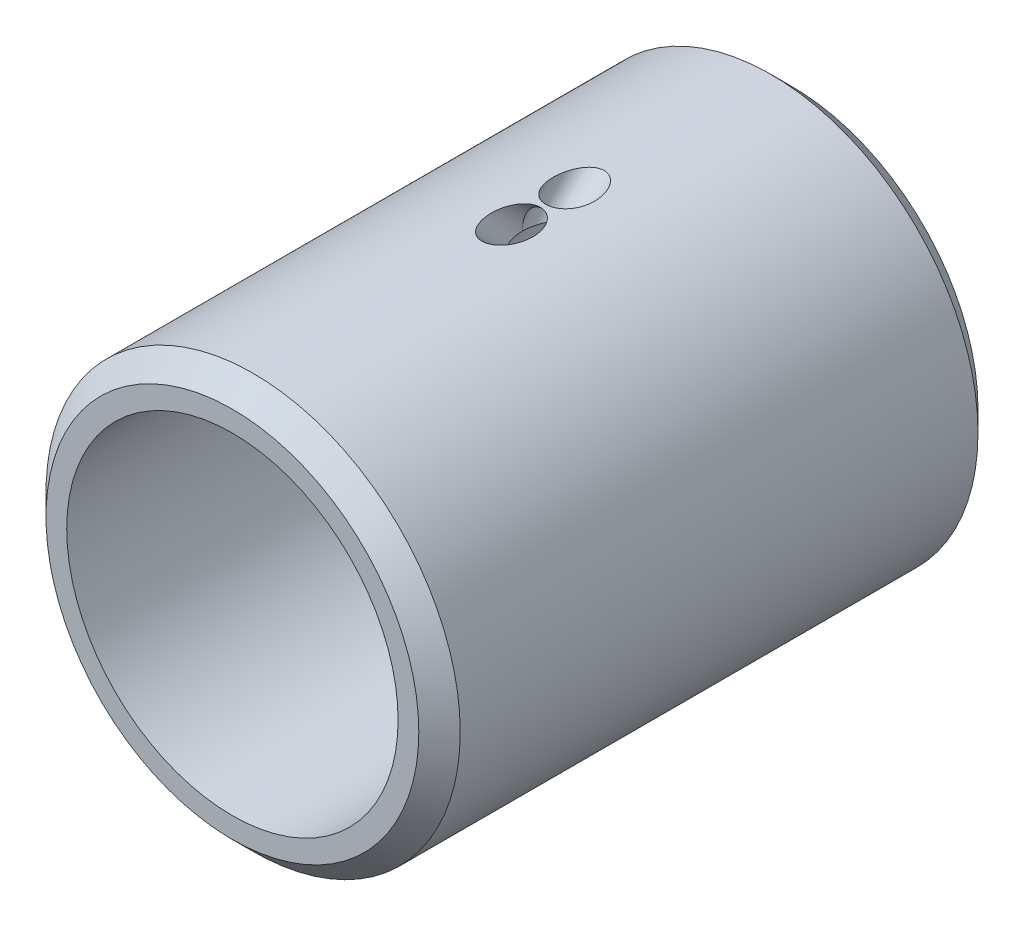
ISO-10303-21;
HEADER;
FILE_DESCRIPTION(('STEP AP214'),'2;1');
FILE_NAME('part.step','',(''),(''),'','','');
FILE_SCHEMA(('AUTOMOTIVE_DESIGN { 1 0 10303 214 1 1 1 1 }'));
ENDSEC;
DATA;
#1=APPLICATION_CONTEXT('core data for automotive mechanical design processes');
#2=APPLICATION_PROTOCOL_DEFINITION('international standard','automotive_design',2000,#1);
#3=PRODUCT_CONTEXT('',#1,'mechanical');
#4=PRODUCT('Part','Part','',(#3));
#5=PRODUCT_RELATED_PRODUCT_CATEGORY('part','',(#4));
#6=PRODUCT_DEFINITION_FORMATION('','',#4);
#7=PRODUCT_DEFINITION_CONTEXT('part definition',#1,'design');
#8=PRODUCT_DEFINITION('design','',#6,#7);
#9=PRODUCT_DEFINITION_SHAPE('','',#8);
#10=(LENGTH_UNIT() NAMED_UNIT(*) SI_UNIT(.MILLI.,.METRE.));
#11=(NAMED_UNIT(*) PLANE_ANGLE_UNIT() SI_UNIT($,.RADIAN.));
#12=(NAMED_UNIT(*) SI_UNIT($,.STERADIAN.) SOLID_ANGLE_UNIT());
#13=UNCERTAINTY_MEASURE_WITH_UNIT(LENGTH_MEASURE(1.E-05),#10,'distance_accuracy_value','');
#14=(GEOMETRIC_REPRESENTATION_CONTEXT(3) GLOBAL_UNCERTAINTY_ASSIGNED_CONTEXT((#13)) GLOBAL_UNIT_ASSIGNED_CONTEXT((#10,
#11,#12)) REPRESENTATION_CONTEXT('',''));
#15=CARTESIAN_POINT('',(0.,0.,0.));
#16=DIRECTION('',(0.,0.,1.));
#17=DIRECTION('',(1.,0.,0.));
#18=AXIS2_PLACEMENT_3D('',#15,#16,#17);
#19=CARTESIAN_POINT('',(0.,0.,13.5));
#20=DIRECTION('',(0.,0.,-1.));
#21=DIRECTION('',(-1.,0.,0.));
#22=AXIS2_PLACEMENT_3D('',#19,#20,#21);
#23=CYLINDRICAL_SURFACE('',#22,10.);
#24=CARTESIAN_POINT('',(0.,0.,-12.5));
#25=DIRECTION('',(0.,0.,1.));
#26=DIRECTION('',(1.,0.,0.));
#27=AXIS2_PLACEMENT_3D('',#24,#25,#26);
#28=CIRCLE('',#27,10.);
#29=CARTESIAN_POINT('',(10.,0.,-12.5));
#30=VERTEX_POINT('',#29);
#31=EDGE_CURVE('E148',#30,#30,#28,.T.);
#32=ORIENTED_EDGE('',*,*,#31,.T.);
#33=EDGE_LOOP('',(#32));
#34=FACE_BOUND('',#33,.T.);
#35=CARTESIAN_POINT('',(0.,0.,12.5));
#36=DIRECTION('',(0.,0.,1.));
#37=DIRECTION('',(1.,0.,0.));
#38=AXIS2_PLACEMENT_3D('',#35,#36,#37);
#39=CIRCLE('',#38,10.);
#40=CARTESIAN_POINT('',(10.,0.,12.5));
#41=VERTEX_POINT('',#40);
#42=EDGE_CURVE('E149',#41,#41,#39,.F.);
#43=ORIENTED_EDGE('',*,*,#42,.T.);
#44=EDGE_LOOP('',(#43));
#45=FACE_BOUND('',#44,.T.);
#46=CARTESIAN_POINT('',(0.,10.,-4.45560334565177));
#47=CARTESIAN_POINT('',(-0.0430175922029069,9.9999995282543,-4.45559795746452));
#48=CARTESIAN_POINT('',(-0.0861154034386779,9.9997180355748,-4.4513506735691));
#49=CARTESIAN_POINT('',(-0.170771376443365,9.99863212797815,-4.43477789679818));
#50=CARTESIAN_POINT('',(-0.212324715112187,9.99782620021694,-4.42242903234997));
#51=CARTESIAN_POINT('',(-0.292269379692312,9.99580740850689,-4.39091122255802));
#52=CARTESIAN_POINT('',(-0.330685907331839,9.99459829138533,-4.37180497771956));
#53=CARTESIAN_POINT('',(-0.404154359835401,9.99189739408338,-4.32806328086593));
#54=CARTESIAN_POINT('',(-0.439206068704791,9.99040559577537,-4.3034274742352));
#55=CARTESIAN_POINT('',(-0.522102477813844,9.98648498731665,-4.23665767205356));
#56=CARTESIAN_POINT('',(-0.567797842285085,9.98395527050908,-4.19186523345632));
#57=CARTESIAN_POINT('',(-0.651576241996719,9.97883829282083,-4.0956387133809));
#58=CARTESIAN_POINT('',(-0.6896384821271,9.97625089552297,-4.04418710036024));
#59=CARTESIAN_POINT('',(-0.774088949710692,9.97012105366139,-3.91266045065657));
#60=CARTESIAN_POINT('',(-0.816577908337737,9.9666695237035,-3.83008193419997));
#61=CARTESIAN_POINT('',(-0.888018774781614,9.9605568292718,-3.65934965108287));
#62=CARTESIAN_POINT('',(-0.91696006023373,9.95789628558334,-3.57119157090873));
#63=CARTESIAN_POINT('',(-0.962847870875545,9.95356580764467,-3.38878954236727));
#64=CARTESIAN_POINT('',(-0.979380068729533,9.95193036932067,-3.29444109290238));
#65=CARTESIAN_POINT('',(-0.999076750449976,9.94997176738178,-3.10426625177232));
#66=CARTESIAN_POINT('',(-1.00222729209099,9.94964997245352,-3.00843842299835));
#67=CARTESIAN_POINT('',(-0.994003994376212,9.95047737420255,-2.80003423422439));
#68=CARTESIAN_POINT('',(-0.979911708755001,9.95190197619134,-2.68755020627845));
#69=CARTESIAN_POINT('',(-0.930632082625948,9.95663444204175,-2.46731787533955));
#70=CARTESIAN_POINT('',(-0.895499028880707,9.95993745835149,-2.35955814852672));
#71=CARTESIAN_POINT('',(-0.821043153942778,9.96627409375972,-2.19697743097933));
#72=CARTESIAN_POINT('',(-0.789380729482218,9.96886021325656,-2.13860548011648));
#73=CARTESIAN_POINT('',(-0.717413370616514,9.97429830083136,-2.02745541947182));
#74=CARTESIAN_POINT('',(-0.677122097863543,9.97714984468661,-1.97466866203937));
#75=CARTESIAN_POINT('',(-0.596381836953261,9.98226562326806,-1.88655788050463));
#76=CARTESIAN_POINT('',(-0.557469709169268,9.98453680792131,-1.84983084907934));
#77=CARTESIAN_POINT('',(-0.474147052887291,9.98883964354327,-1.78320037998162));
#78=CARTESIAN_POINT('',(-0.429742145623849,9.99087153531019,-1.75329005387244));
#79=CARTESIAN_POINT('',(-0.343246482546267,9.99418635273349,-1.70589015204874));
#80=CARTESIAN_POINT('',(-0.301813615642016,9.99553597973323,-1.6872086103069));
#81=CARTESIAN_POINT('',(-0.216387868462078,9.99774957386018,-1.65701931648866));
#82=CARTESIAN_POINT('',(-0.172396269936963,9.9986137818761,-1.64550800588242));
#83=CARTESIAN_POINT('',(-0.0828997755163983,9.99975675019116,-1.63035282145172));
#84=CARTESIAN_POINT('',(-0.0373901968101869,10.0000334874729,-1.62673613238466));
#85=CARTESIAN_POINT('',(0.0535406577510461,9.99995999159295,-1.62770200991846));
#86=CARTESIAN_POINT('',(0.0989619377920764,9.99960978891613,-1.63228417785033));
#87=CARTESIAN_POINT('',(0.185695303500094,9.99836451625599,-1.64883518809944));
#88=CARTESIAN_POINT('',(0.227093460001555,9.99750195169451,-1.66036390754627));
#89=CARTESIAN_POINT('',(0.307538959886723,9.99535097570242,-1.68977113603488));
#90=CARTESIAN_POINT('',(0.346586008122357,9.99406251093732,-1.70765044036633));
#91=CARTESIAN_POINT('',(0.424106206717931,9.99108297267115,-1.75027813065323));
#92=CARTESIAN_POINT('',(0.462370228303274,9.98937089246965,-1.77540290689518));
#93=CARTESIAN_POINT('',(0.534931541252051,9.98574836082187,-1.83080703195865));
#94=CARTESIAN_POINT('',(0.569226485644752,9.98383779326142,-1.86108940464773));
#95=CARTESIAN_POINT('',(0.648977394045503,9.97903325050302,-1.94119518736972));
#96=CARTESIAN_POINT('',(0.691984763925929,9.97610370552518,-1.99346283388779));
#97=CARTESIAN_POINT('',(0.768995052977722,9.97046336700629,-2.10428445234667));
#98=CARTESIAN_POINT('',(0.802977386562733,9.9677530832065,-2.16285237485377));
#99=CARTESIAN_POINT('',(0.872373836849445,9.96195610579881,-2.30462881021939));
#100=CARTESIAN_POINT('',(0.904415056385094,9.95905010076739,-2.38949241658885));
#101=CARTESIAN_POINT('',(0.954489759644645,9.95437433856627,-2.5631859363808));
#102=CARTESIAN_POINT('',(0.972514561543103,9.95260528574684,-2.6520182720901));
#103=CARTESIAN_POINT('',(0.995949729848496,9.95028767880284,-2.83335351797878));
#104=CARTESIAN_POINT('',(1.00106569445954,9.94976762208552,-2.92589400832888));
#105=CARTESIAN_POINT('',(0.998567048549918,9.95001802750757,-3.11087266453808));
#106=CARTESIAN_POINT('',(0.990937682514816,9.95078998543907,-3.20331058764673));
#107=CARTESIAN_POINT('',(0.960313937693901,9.95379822453928,-3.40502253774957));
#108=CARTESIAN_POINT('',(0.934497241063704,9.95630160455089,-3.51387508117704));
#109=CARTESIAN_POINT('',(0.863958723532265,9.96267316882256,-3.72526049121501));
#110=CARTESIAN_POINT('',(0.819276963242366,9.96653845815972,-3.82780622493695));
#111=CARTESIAN_POINT('',(0.732961563362929,9.97314991831755,-3.97900641688596));
#112=CARTESIAN_POINT('',(0.698415316751326,9.97565409902691,-4.03174028300838));
#113=CARTESIAN_POINT('',(0.622074811754607,9.98070593495425,-4.13169017945617));
#114=CARTESIAN_POINT('',(0.580292607541221,9.98325351161532,-4.17891517129602));
#115=CARTESIAN_POINT('',(0.499453118403524,9.98758169933761,-4.25558146920386));
#116=CARTESIAN_POINT('',(0.461927892168232,9.98940519456183,-4.28662675020966));
#117=CARTESIAN_POINT('',(0.38236426253987,9.99276612823471,-4.34237202204372));
#118=CARTESIAN_POINT('',(0.340330353062511,9.99430384742076,-4.36707824933959));
#119=CARTESIAN_POINT('',(0.260764723281342,9.99666297641511,-4.40435630584585));
#120=CARTESIAN_POINT('',(0.223900271531426,9.99756503344201,-4.41834302790645));
#121=CARTESIAN_POINT('',(0.148387844101937,9.99896970686305,-4.43996448096582));
#122=CARTESIAN_POINT('',(0.109745062054893,9.99947341691357,-4.44761660624155));
#123=CARTESIAN_POINT('',(0.0590276868626185,9.99983277824967,-4.45306948472397));
#124=CARTESIAN_POINT('',(0.0472447527186292,9.99989534615361,-4.45401806543143));
#125=CARTESIAN_POINT('',(0.0236432370017199,9.99997902577716,-4.45528579583922));
#126=CARTESIAN_POINT('',(0.0118246491227433,10.0000001296732,-4.45560482675334));
#127=CARTESIAN_POINT('',(0.,10.,-4.45560334565177));
#128=B_SPLINE_CURVE_WITH_KNOTS('',3,(#46,#47,#48,#49,#50,#51,#52,#53,#54,#55,#56,#57,#58,#59,
#60,#61,#62,#63,#64,#65,#66,#67,#68,#69,#70,#71,#72,#73,#74,#75,#76,#77,#78,#79,#80,#81,#82,#83,
#84,#85,#86,#87,#88,#89,#90,#91,#92,#93,#94,#95,#96,#97,#98,#99,#100,#101,#102,#103,#104,#105,
#106,#107,#108,#109,#110,#111,#112,#113,#114,#115,#116,#117,#118,#119,#120,#121,#122,#123,#124,
#125,#126,#127),.UNSPECIFIED.,.T.,.F.,(4,2,2,2,2,2,2,2,2,2,2,2,2,2,2,2,2,2,2,2,2,2,2,2,2,2,2,2,
2,2,2,2,2,2,2,2,2,2,2,2,4),(0.,0.128994512676195,0.258362796888067,0.386560897435531,
0.514767221787772,0.705806455730978,0.897359276174138,1.17465390898542,1.45216559835563,
1.73857487764075,2.02528249105191,2.36363373014448,2.70111573593844,2.89985496633768,
3.09828183816402,3.25834151024618,3.41823871402509,3.55406579819996,3.68982541862919,
3.82605178828415,3.96227153411876,4.09065452548321,4.21905360004124,4.35595303734816,
4.49293301601625,4.69505695599853,4.89763804464303,5.16845185693481,5.43943327907155,
5.71654108494682,5.99396992623697,6.32811562738355,6.66155529943244,6.85033628563928,
7.03880576013682,7.18452028578419,7.33009090053938,7.44793645284346,7.56545732748264,
7.60090857084085,7.63636650265537),.UNSPECIFIED.);
#129=CARTESIAN_POINT('',(0.,10.,-4.45560334565177));
#130=VERTEX_POINT('',#129);
#131=EDGE_CURVE('E77',#130,#130,#128,.T.);
#132=ORIENTED_EDGE('',*,*,#131,.F.);
#133=EDGE_LOOP('',(#132));
#134=FACE_BOUND('',#133,.T.);
#135=CARTESIAN_POINT('',(0.,10.,1.45560334565176));
#136=CARTESIAN_POINT('',(0.043017592202907,9.9999995282543,1.45559795746451));
#137=CARTESIAN_POINT('',(0.0861154034386781,9.9997180355748,1.45135067356909));
#138=CARTESIAN_POINT('',(0.170771376443365,9.99863212797815,1.43477789679818));
#139=CARTESIAN_POINT('',(0.212324715112187,9.99782620021694,1.42242903234997));
#140=CARTESIAN_POINT('',(0.292269379692311,9.99580740850689,1.39091122255801));
#141=CARTESIAN_POINT('',(0.330685907331838,9.99459829138532,1.37180497771955));
#142=CARTESIAN_POINT('',(0.404154359835399,9.99189739408338,1.32806328086593));
#143=CARTESIAN_POINT('',(0.439206068704791,9.99040559577537,1.3034274742352));
#144=CARTESIAN_POINT('',(0.522102477813844,9.98648498731666,1.23665767205356));
#145=CARTESIAN_POINT('',(0.567797842285084,9.98395527050908,1.19186523345632));
#146=CARTESIAN_POINT('',(0.651576241996718,9.97883829282083,1.0956387133809));
#147=CARTESIAN_POINT('',(0.689638482127099,9.97625089552297,1.04418710036024));
#148=CARTESIAN_POINT('',(0.774088949710691,9.97012105366139,0.912660450656568));
#149=CARTESIAN_POINT('',(0.816577908337736,9.9666695237035,0.830081934199971));
#150=CARTESIAN_POINT('',(0.888018774781613,9.9605568292718,0.659349651082872));
#151=CARTESIAN_POINT('',(0.916960060233729,9.95789628558334,0.571191570908735));
#152=CARTESIAN_POINT('',(0.962847870875544,9.95356580764467,0.388789542367274));
#153=CARTESIAN_POINT('',(0.979380068729532,9.95193036932067,0.294441092902382));
#154=CARTESIAN_POINT('',(0.999076750449976,9.94997176738178,0.104266251772326));
#155=CARTESIAN_POINT('',(1.00222729209099,9.94964997245352,0.00843842299835436));
#156=CARTESIAN_POINT('',(0.994003994376212,9.95047737420255,-0.199965765775605));
#157=CARTESIAN_POINT('',(0.979911708755002,9.95190197619134,-0.31244979372155));
#158=CARTESIAN_POINT('',(0.930632082625949,9.95663444204175,-0.532682124660448));
#159=CARTESIAN_POINT('',(0.895499028880709,9.95993745835149,-0.640441851473274));
#160=CARTESIAN_POINT('',(0.82104315394278,9.96627409375972,-0.803022569020666));
#161=CARTESIAN_POINT('',(0.78938072948222,9.96886021325656,-0.861394519883516));
#162=CARTESIAN_POINT('',(0.717413370616517,9.97429830083136,-0.97254458052818));
#163=CARTESIAN_POINT('',(0.677122097863545,9.97714984468661,-1.02533133796063));
#164=CARTESIAN_POINT('',(0.596381836953263,9.98226562326806,-1.11344211949537));
#165=CARTESIAN_POINT('',(0.55746970916927,9.98453680792131,-1.15016915092066));
#166=CARTESIAN_POINT('',(0.474147052887294,9.98883964354327,-1.21679962001838));
#167=CARTESIAN_POINT('',(0.429742145623852,9.99087153531019,-1.24670994612756));
#168=CARTESIAN_POINT('',(0.34324648254627,9.99418635273349,-1.29410984795126));
#169=CARTESIAN_POINT('',(0.301813615642018,9.99553597973323,-1.3127913896931));
#170=CARTESIAN_POINT('',(0.21638786846208,9.99774957386018,-1.34298068351134));
#171=CARTESIAN_POINT('',(0.172396269936965,9.9986137818761,-1.35449199411759));
#172=CARTESIAN_POINT('',(0.0828997755164006,9.99975675019116,-1.36964717854828));
#173=CARTESIAN_POINT('',(0.0373901968101892,10.0000334874729,-1.37326386761535));
#174=CARTESIAN_POINT('',(-0.0535406577510439,9.99995999159295,-1.37229799008154));
#175=CARTESIAN_POINT('',(-0.0989619377920743,9.99960978891613,-1.36771582214967));
#176=CARTESIAN_POINT('',(-0.185695303500092,9.99836451625599,-1.35116481190057));
#177=CARTESIAN_POINT('',(-0.227093460001553,9.99750195169451,-1.33963609245374));
#178=CARTESIAN_POINT('',(-0.307538959886721,9.99535097570242,-1.31022886396512));
#179=CARTESIAN_POINT('',(-0.346586008122355,9.99406251093732,-1.29234955963367));
#180=CARTESIAN_POINT('',(-0.424106206717929,9.99108297267115,-1.24972186934678));
#181=CARTESIAN_POINT('',(-0.462370228303272,9.98937089246965,-1.22459709310482));
#182=CARTESIAN_POINT('',(-0.53493154125205,9.98574836082187,-1.16919296804135));
#183=CARTESIAN_POINT('',(-0.569226485644751,9.98383779326142,-1.13891059535228));
#184=CARTESIAN_POINT('',(-0.648977394045503,9.97903325050302,-1.05880481263028));
#185=CARTESIAN_POINT('',(-0.691984763925928,9.97610370552518,-1.00653716611222));
#186=CARTESIAN_POINT('',(-0.768995052977721,9.97046336700629,-0.89571554765333));
#187=CARTESIAN_POINT('',(-0.802977386562733,9.9677530832065,-0.837147625146231));
#188=CARTESIAN_POINT('',(-0.872373836849444,9.96195610579881,-0.695371189780614));
#189=CARTESIAN_POINT('',(-0.904415056385094,9.95905010076739,-0.610507583411157));
#190=CARTESIAN_POINT('',(-0.954489759644644,9.95437433856627,-0.436814063619203));
#191=CARTESIAN_POINT('',(-0.972514561543103,9.95260528574684,-0.347981727909899));
#192=CARTESIAN_POINT('',(-0.995949729848496,9.95028767880284,-0.166646482021218));
#193=CARTESIAN_POINT('',(-1.00106569445954,9.94976762208552,-0.0741059916711216));
#194=CARTESIAN_POINT('',(-0.998567048549919,9.95001802750757,0.110872664538081));
#195=CARTESIAN_POINT('',(-0.990937682514816,9.95078998543907,0.20331058764673));
#196=CARTESIAN_POINT('',(-0.960313937693901,9.95379822453928,0.405022537749565));
#197=CARTESIAN_POINT('',(-0.934497241063704,9.95630160455089,0.513875081177039));
#198=CARTESIAN_POINT('',(-0.863958723532265,9.96267316882256,0.725260491215008));
#199=CARTESIAN_POINT('',(-0.819276963242366,9.96653845815972,0.827806224936948));
#200=CARTESIAN_POINT('',(-0.732961563362929,9.97314991831755,0.979006416885953));
#201=CARTESIAN_POINT('',(-0.698415316751325,9.97565409902691,1.03174028300838));
#202=CARTESIAN_POINT('',(-0.622074811754607,9.98070593495425,1.13169017945617));
#203=CARTESIAN_POINT('',(-0.580292607541222,9.98325351161532,1.17891517129602));
#204=CARTESIAN_POINT('',(-0.499453118403525,9.98758169933761,1.25558146920386));
#205=CARTESIAN_POINT('',(-0.461927892168233,9.98940519456182,1.28662675020965));
#206=CARTESIAN_POINT('',(-0.38236426253987,9.99276612823471,1.34237202204371));
#207=CARTESIAN_POINT('',(-0.340330353062512,9.99430384742076,1.36707824933958));
#208=CARTESIAN_POINT('',(-0.260764723281343,9.99666297641511,1.40435630584584));
#209=CARTESIAN_POINT('',(-0.223900271531427,9.99756503344201,1.41834302790645));
#210=CARTESIAN_POINT('',(-0.148387844101938,9.99896970686305,1.43996448096581));
#211=CARTESIAN_POINT('',(-0.109745062054894,9.99947341691357,1.44761660624155));
#212=CARTESIAN_POINT('',(-0.0590276868626197,9.99983277824967,1.45306948472397));
#213=CARTESIAN_POINT('',(-0.04724475271863,9.99989534615361,1.45401806543143));
#214=CARTESIAN_POINT('',(-0.0236432370017202,9.99997902577716,1.45528579583922));
#215=CARTESIAN_POINT('',(-0.0118246491227435,10.0000001296732,1.45560482675334));
#216=CARTESIAN_POINT('',(0.,10.,1.45560334565176));
#217=B_SPLINE_CURVE_WITH_KNOTS('',3,(#135,#136,#137,#138,#139,#140,#141,#142,#143,#144,#145,
#146,#147,#148,#149,#150,#151,#152,#153,#154,#155,#156,#157,#158,#159,#160,#161,#162,#163,#164,
#165,#166,#167,#168,#169,#170,#171,#172,#173,#174,#175,#176,#177,#178,#179,#180,#181,#182,#183,
#184,#185,#186,#187,#188,#189,#190,#191,#192,#193,#194,#195,#196,#197,#198,#199,#200,#201,#202,
#203,#204,#205,#206,#207,#208,#209,#210,#211,#212,#213,#214,#215,#216),.UNSPECIFIED.,.T.,.F.,(4,
2,2,2,2,2,2,2,2,2,2,2,2,2,2,2,2,2,2,2,2,2,2,2,2,2,2,2,2,2,2,2,2,2,2,2,2,2,2,2,4),(0.,
0.128994512676195,0.258362796888067,0.38656089743553,0.514767221787771,0.705806455730977,
0.897359276174136,1.17465390898542,1.45216559835562,1.73857487764074,2.0252824910519,
2.36363373014447,2.70111573593843,2.89985496633768,3.09828183816402,3.25834151024618,
3.41823871402508,3.55406579819996,3.68982541862919,3.82605178828414,3.96227153411876,
4.09065452548321,4.21905360004124,4.35595303734816,4.49293301601625,4.69505695599853,
4.89763804464303,5.16845185693481,5.43943327907155,5.71654108494682,5.99396992623697,
6.32811562738355,6.66155529943244,6.85033628563929,7.03880576013682,7.18452028578418,
7.33009090053937,7.44793645284346,7.56545732748264,7.60090857084085,7.63636650265537),.UNSPECIFIED.);
#218=CARTESIAN_POINT('',(0.,10.,1.45560334565176));
#219=VERTEX_POINT('',#218);
#220=EDGE_CURVE('E119',#219,#219,#217,.T.);
#221=ORIENTED_EDGE('',*,*,#220,.F.);
#222=EDGE_LOOP('',(#221));
#223=FACE_BOUND('',#222,.T.);
#224=ADVANCED_FACE('F47',(#34,#45,#134,#223),#23,.T.);
#225=CARTESIAN_POINT('',(0.,0.,0.5));
#226=DIRECTION('',(0.,0.,-1.));
#227=DIRECTION('',(-1.,0.,0.));
#228=AXIS2_PLACEMENT_3D('',#225,#226,#227);
#229=CYLINDRICAL_SURFACE('',#228,8.5);
#230=CARTESIAN_POINT('',(0.,0.,-3.5));
#231=DIRECTION('',(0.,0.,-1.));
#232=DIRECTION('',(-1.,0.,0.));
#233=AXIS2_PLACEMENT_3D('',#230,#231,#232);
#234=CIRCLE('',#233,8.5);
#235=CARTESIAN_POINT('',(-8.5,0.,-3.5));
#236=VERTEX_POINT('',#235);
#237=EDGE_CURVE('E166',#236,#236,#234,.T.);
#238=ORIENTED_EDGE('',*,*,#237,.T.);
#239=EDGE_LOOP('',(#238));
#240=FACE_BOUND('',#239,.T.);
#241=CARTESIAN_POINT('',(0.,0.,0.5));
#242=DIRECTION('',(0.,0.,-1.));
#243=DIRECTION('',(-1.,0.,0.));
#244=AXIS2_PLACEMENT_3D('',#241,#242,#243);
#245=CIRCLE('',#244,8.5);
#246=CARTESIAN_POINT('',(-8.5,0.,0.5));
#247=VERTEX_POINT('',#246);
#248=EDGE_CURVE('E160',#247,#247,#245,.T.);
#249=ORIENTED_EDGE('',*,*,#248,.F.);
#250=EDGE_LOOP('',(#249));
#251=FACE_BOUND('',#250,.T.);
#252=CARTESIAN_POINT('',(0.,8.5,-0.0443966543482392));
#253=CARTESIAN_POINT('',(-0.0428469445865301,8.49999974344543,-0.0443991781735162));
#254=CARTESIAN_POINT('',(-0.0857041077294655,8.49967153214081,-0.0486573240578311));
#255=CARTESIAN_POINT('',(-0.169822949016437,8.49840794592784,-0.0652364278679007));
#256=CARTESIAN_POINT('',(-0.211082899568107,8.4974719320307,-0.0775658713386986));
#257=CARTESIAN_POINT('',(-0.290451688305473,8.49512831321412,-0.109002771492554));
#258=CARTESIAN_POINT('',(-0.328584632855731,8.49372484487284,-0.128050858142258));
#259=CARTESIAN_POINT('',(-0.401521912200255,8.49058981413185,-0.171627073561517));
#260=CARTESIAN_POINT('',(-0.436324675924316,8.48885809801279,-0.196157770820938));
#261=CARTESIAN_POINT('',(-0.519093193057266,8.48428127068212,-0.262955093106234));
#262=CARTESIAN_POINT('',(-0.56486071919529,8.48131465886039,-0.307932013011684));
#263=CARTESIAN_POINT('',(-0.648774590095587,8.47530910135093,-0.404514582839898));
#264=CARTESIAN_POINT('',(-0.686900220766654,8.47226998339852,-0.456137642725328));
#265=CARTESIAN_POINT('',(-0.771944908466921,8.46502725604572,-0.588688625368842));
#266=CARTESIAN_POINT('',(-0.814860655299269,8.46092987281599,-0.672186548236499));
#267=CARTESIAN_POINT('',(-0.887036720874934,8.45366575623558,-0.844810226061303));
#268=CARTESIAN_POINT('',(-0.9162864214105,8.45049974724652,-0.933940296233865));
#269=CARTESIAN_POINT('',(-0.962678434151493,8.44534269018183,-1.11842220673335));
#270=CARTESIAN_POINT('',(-0.979393566865652,8.44339344787003,-1.21388219281294));
#271=CARTESIAN_POINT('',(-0.999216639911983,8.44106987312362,-1.40631789179791));
#272=CARTESIAN_POINT('',(-1.00230913819946,8.44069732798527,-1.50329519982735));
#273=CARTESIAN_POINT('',(-0.993590646718016,8.44173116562389,-1.71330010266723));
#274=CARTESIAN_POINT('',(-0.979137399402005,8.44345303678972,-1.82623300444481));
#275=CARTESIAN_POINT('',(-0.928689769066019,8.44915467443429,-2.04713841454067));
#276=CARTESIAN_POINT('',(-0.892758190405114,8.45312785614376,-2.1551244007321));
#277=CARTESIAN_POINT('',(-0.817110383985831,8.46067772188565,-2.31647687909016));
#278=CARTESIAN_POINT('',(-0.78540065052536,8.46371325471159,-2.3736509375053));
#279=CARTESIAN_POINT('',(-0.713496193363717,8.47007864866553,-2.48237379966806));
#280=CARTESIAN_POINT('',(-0.673315764095803,8.47340800852129,-2.53393186094985));
#281=CARTESIAN_POINT('',(-0.592587688699902,8.47939587624753,-2.62027918116883));
#282=CARTESIAN_POINT('',(-0.553478167595544,8.48206472778554,-2.65640684419803));
#283=CARTESIAN_POINT('',(-0.469819840026926,8.48710912334177,-2.72180894600186));
#284=CARTESIAN_POINT('',(-0.425272242923522,8.48948473233801,-2.75108490430153));
#285=CARTESIAN_POINT('',(-0.33112731075181,8.49367927704926,-2.80131445441207));
#286=CARTESIAN_POINT('',(-0.281489626851906,8.4954932195454,-2.82219386361943));
#287=CARTESIAN_POINT('',(-0.179033783988305,8.49826793648835,-2.85368914877047));
#288=CARTESIAN_POINT('',(-0.126219097704449,8.49922962504034,-2.86431602240204));
#289=CARTESIAN_POINT('',(-0.0273579873854091,8.50007837047425,-2.87369336257676));
#290=CARTESIAN_POINT('',(0.0185485157350155,8.50010203382952,-2.87395357866588));
#291=CARTESIAN_POINT('',(0.109670315293171,8.4994144279027,-2.86635909156776));
#292=CARTESIAN_POINT('',(0.154885777649666,8.49870333793993,-2.85850636837405));
#293=CARTESIAN_POINT('',(0.241103824713428,8.49668416412604,-2.8357611486844));
#294=CARTESIAN_POINT('',(0.282204315315494,8.49540692231039,-2.82123107332276));
#295=CARTESIAN_POINT('',(0.36165279865586,8.49239599678586,-2.78603931871979));
#296=CARTESIAN_POINT('',(0.4000003568242,8.49066224121378,-2.76537667404041));
#297=CARTESIAN_POINT('',(0.476556960786484,8.48672442787266,-2.71676319216628));
#298=CARTESIAN_POINT('',(0.514457479258871,8.4844924247285,-2.68833133737483));
#299=CARTESIAN_POINT('',(0.585865851223537,8.47986104278043,-2.6264368005365));
#300=CARTESIAN_POINT('',(0.619370884071758,8.47746155799948,-2.59297091736215));
#301=CARTESIAN_POINT('',(0.697167598811514,8.4714903031555,-2.50467830286326));
#302=CARTESIAN_POINT('',(0.738706669018249,8.46791988261882,-2.44741655043033));
#303=CARTESIAN_POINT('',(0.812004460438839,8.4612057588578,-2.32690054097187));
#304=CARTESIAN_POINT('',(0.843740509590497,8.45806305408289,-2.26363282851012));
#305=CARTESIAN_POINT('',(0.906967466141782,8.45155293388313,-2.11170967420471));
#306=CARTESIAN_POINT('',(0.93491536404477,8.44845413315613,-2.0215708174255));
#307=CARTESIAN_POINT('',(0.976018422288799,8.44380243843743,-1.83805713495618));
#308=CARTESIAN_POINT('',(0.989166884195882,8.44225024449827,-1.74468086366));
#309=CARTESIAN_POINT('',(1.00200086912054,8.44073678445488,-1.5550813177788));
#310=CARTESIAN_POINT('',(1.00140269502523,8.440809042428,-1.45883907613276));
#311=CARTESIAN_POINT('',(0.986723294972022,8.4425364510701,-1.26728571145889));
#312=CARTESIAN_POINT('',(0.972617980826739,8.44419442965435,-1.17197655928773));
#313=CARTESIAN_POINT('',(0.927205357930455,8.44931608715766,-0.967631957753731));
#314=CARTESIAN_POINT('',(0.893300440980937,8.45304690913221,-0.859144327218453));
#315=CARTESIAN_POINT('',(0.827586489782476,8.45964306140472,-0.702961892857126));
#316=CARTESIAN_POINT('',(0.80323439334305,8.4620058507392,-0.65203558798651));
#317=CARTESIAN_POINT('',(0.749256370152974,8.46695668147552,-0.553094482862894));
#318=CARTESIAN_POINT('',(0.719636491904295,8.46954446281647,-0.505076427219817));
#319=CARTESIAN_POINT('',(0.65521380291145,8.4747698313893,-0.413669509871975));
#320=CARTESIAN_POINT('',(0.620493337695093,8.47740613235454,-0.370223105097389));
#321=CARTESIAN_POINT('',(0.545219205051582,8.48257954795231,-0.288701711891381));
#322=CARTESIAN_POINT('',(0.504674044665791,8.48511680049035,-0.250619047558821));
#323=CARTESIAN_POINT('',(0.425855031166612,8.48939894280584,-0.188407573079437));
#324=CARTESIAN_POINT('',(0.388600814234586,8.49120294828579,-0.16300185569393));
#325=CARTESIAN_POINT('',(0.310432277266807,8.49441899365438,-0.118557861688144));
#326=CARTESIAN_POINT('',(0.269522419683093,8.49583150302851,-0.0995119526663416));
#327=CARTESIAN_POINT('',(0.190792321488037,8.49793635852365,-0.0714334956892937));
#328=CARTESIAN_POINT('',(0.153344828223083,8.49870197611144,-0.0613704479053548));
#329=CARTESIAN_POINT('',(0.07726722711816,8.49973377789386,-0.0478526706920584));
#330=CARTESIAN_POINT('',(0.0386377682995736,8.50000023135129,-0.0443943784572223));
#331=CARTESIAN_POINT('',(0.,8.5,-0.0443966543482392));
#332=B_SPLINE_CURVE_WITH_KNOTS('',3,(#252,#253,#254,#255,#256,#257,#258,#259,#260,#261,#262,
#263,#264,#265,#266,#267,#268,#269,#270,#271,#272,#273,#274,#275,#276,#277,#278,#279,#280,#281,
#282,#283,#284,#285,#286,#287,#288,#289,#290,#291,#292,#293,#294,#295,#296,#297,#298,#299,#300,
#301,#302,#303,#304,#305,#306,#307,#308,#309,#310,#311,#312,#313,#314,#315,#316,#317,#318,#319,
#320,#321,#322,#323,#324,#325,#326,#327,#328,#329,#330,#331),.UNSPECIFIED.,.T.,.F.,(4,2,2,2,2,2,
2,2,2,2,2,2,2,2,2,2,2,2,2,2,2,2,2,2,2,2,2,2,2,2,2,2,2,2,2,2,2,2,2,4),(0.,0.128359589252103,
0.256854343150817,0.384240968124288,0.51168739666058,0.703319787652341,0.895464793725293,
1.17585673878797,1.45646618121232,1.74625138189205,2.0363649864804,2.37614860280356,
2.71494349181378,2.91066235500346,3.10605354608384,3.26536136346479,3.42463381707852,
3.58528404295502,3.74576175034381,3.88276732578445,4.01973947239285,4.1500242303212,
4.28032950960637,4.42208981848391,4.5639406565159,4.77525664068948,4.98705775132235,
5.26881374129484,5.55069720679473,5.83840318849958,6.12662321294913,6.46573455123558,
6.63498508052033,6.80404251533804,6.97062162505451,7.13695987167049,7.27185255115021,
7.40658275927986,7.52239511503896,7.63814498043567),.UNSPECIFIED.);
#333=CARTESIAN_POINT('',(0.999922297132052,8.44098071314573,-1.5));
#334=VERTEX_POINT('',#333);
#335=CARTESIAN_POINT('',(-0.99992229713205,8.44098071314573,-1.50000000000012));
#336=VERTEX_POINT('',#335);
#337=EDGE_CURVE('E12',#334,#336,#332,.T.);
#338=ORIENTED_EDGE('',*,*,#337,.F.);
#339=CARTESIAN_POINT('',(0.,8.5,-2.95560334565176));
#340=CARTESIAN_POINT('',(0.0428469445865301,8.49999974344543,-2.95560082182649));
#341=CARTESIAN_POINT('',(0.0857041077294656,8.49967153214081,-2.95134267594217));
#342=CARTESIAN_POINT('',(0.169822949016437,8.49840794592784,-2.9347635721321));
#343=CARTESIAN_POINT('',(0.211082899568107,8.4974719320307,-2.92243412866131));
#344=CARTESIAN_POINT('',(0.290451688305473,8.49512831321412,-2.89099722850745));
#345=CARTESIAN_POINT('',(0.32858463285573,8.49372484487284,-2.87194914185774));
#346=CARTESIAN_POINT('',(0.401521912200254,8.49058981413185,-2.82837292643849));
#347=CARTESIAN_POINT('',(0.436324675924316,8.48885809801279,-2.80384222917907));
#348=CARTESIAN_POINT('',(0.519093193057266,8.48428127068212,-2.73704490689377));
#349=CARTESIAN_POINT('',(0.564860719195289,8.48131465886039,-2.69206798698832));
#350=CARTESIAN_POINT('',(0.648774590095586,8.47530910135093,-2.5954854171601));
#351=CARTESIAN_POINT('',(0.686900220766654,8.47226998339852,-2.54386235727468));
#352=CARTESIAN_POINT('',(0.77194490846692,8.46502725604572,-2.41131137463116));
#353=CARTESIAN_POINT('',(0.814860655299268,8.46092987281599,-2.32781345176351));
#354=CARTESIAN_POINT('',(0.887036720874933,8.45366575623558,-2.1551897739387));
#355=CARTESIAN_POINT('',(0.916286421410499,8.45049974724652,-2.06605970376614));
#356=CARTESIAN_POINT('',(0.962678434151492,8.44534269018183,-1.88157779326666));
#357=CARTESIAN_POINT('',(0.979393566865652,8.44339344787003,-1.78611780718706));
#358=CARTESIAN_POINT('',(0.999216639911983,8.44106987312362,-1.59368210820209));
#359=CARTESIAN_POINT('',(1.00230913819946,8.44069732798527,-1.49670480017265));
#360=CARTESIAN_POINT('',(0.993590646718017,8.44173116562389,-1.28669989733278));
#361=CARTESIAN_POINT('',(0.979137399402006,8.44345303678972,-1.1737669955552));
#362=CARTESIAN_POINT('',(0.92868976906602,8.44915467443429,-0.952861585459341));
#363=CARTESIAN_POINT('',(0.892758190405116,8.45312785614376,-0.844875599267904));
#364=CARTESIAN_POINT('',(0.817110383985833,8.46067772188565,-0.683523120909851));
#365=CARTESIAN_POINT('',(0.785400650525362,8.46371325471159,-0.626349062494706));
#366=CARTESIAN_POINT('',(0.713496193363719,8.47007864866553,-0.517626200331941));
#367=CARTESIAN_POINT('',(0.673315764095805,8.47340800852129,-0.466068139050157));
#368=CARTESIAN_POINT('',(0.592587688699904,8.47939587624753,-0.379720818831173));
#369=CARTESIAN_POINT('',(0.553478167595545,8.48206472778554,-0.343593155801971));
#370=CARTESIAN_POINT('',(0.469819840026928,8.48710912334177,-0.278191053998143));
#371=CARTESIAN_POINT('',(0.425272242923524,8.48948473233801,-0.248915095698471));
#372=CARTESIAN_POINT('',(0.331127310751812,8.49367927704926,-0.198685545587933));
#373=CARTESIAN_POINT('',(0.281489626851908,8.4954932195454,-0.17780613638057));
#374=CARTESIAN_POINT('',(0.179033783988307,8.49826793648835,-0.14631085122953));
#375=CARTESIAN_POINT('',(0.126219097704452,8.49922962504034,-0.135683977597962));
#376=CARTESIAN_POINT('',(0.0273579873854114,8.50007837047425,-0.126306637423245));
#377=CARTESIAN_POINT('',(-0.0185485157350132,8.50010203382952,-0.126046421334123));
#378=CARTESIAN_POINT('',(-0.109670315293169,8.4994144279027,-0.133640908432241));
#379=CARTESIAN_POINT('',(-0.154885777649664,8.49870333793993,-0.141493631625952));
#380=CARTESIAN_POINT('',(-0.241103824713426,8.49668416412604,-0.1642388513156));
#381=CARTESIAN_POINT('',(-0.282204315315492,8.49540692231039,-0.178768926677245));
#382=CARTESIAN_POINT('',(-0.361652798655858,8.49239599678586,-0.213960681280208));
#383=CARTESIAN_POINT('',(-0.400000356824199,8.49066224121378,-0.234623325959593));
#384=CARTESIAN_POINT('',(-0.476556960786482,8.48672442787266,-0.283236807833718));
#385=CARTESIAN_POINT('',(-0.51445747925887,8.4844924247285,-0.311668662625168));
#386=CARTESIAN_POINT('',(-0.585865851223536,8.47986104278043,-0.3735631994635));
#387=CARTESIAN_POINT('',(-0.619370884071756,8.47746155799948,-0.407029082637853));
#388=CARTESIAN_POINT('',(-0.697167598811512,8.4714903031555,-0.495321697136737));
#389=CARTESIAN_POINT('',(-0.738706669018247,8.46791988261882,-0.552583449569668));
#390=CARTESIAN_POINT('',(-0.812004460438838,8.4612057588578,-0.673099459028126));
#391=CARTESIAN_POINT('',(-0.843740509590495,8.45806305408289,-0.736367171489876));
#392=CARTESIAN_POINT('',(-0.906967466141781,8.45155293388313,-0.888290325795286));
#393=CARTESIAN_POINT('',(-0.934915364044769,8.44845413315613,-0.978429182574498));
#394=CARTESIAN_POINT('',(-0.976018422288798,8.44380243843743,-1.16194286504382));
#395=CARTESIAN_POINT('',(-0.989166884195881,8.44225024449827,-1.25531913634));
#396=CARTESIAN_POINT('',(-1.00200086912054,8.44073678445488,-1.4449186822212));
#397=CARTESIAN_POINT('',(-1.00140269502523,8.440809042428,-1.54116092386724));
#398=CARTESIAN_POINT('',(-0.986723294972022,8.4425364510701,-1.7327142885411));
#399=CARTESIAN_POINT('',(-0.972617980826739,8.44419442965435,-1.82802344071227));
#400=CARTESIAN_POINT('',(-0.927205357930456,8.44931608715766,-2.03236804224627));
#401=CARTESIAN_POINT('',(-0.893300440980938,8.45304690913221,-2.14085567278155));
#402=CARTESIAN_POINT('',(-0.827586489782478,8.45964306140472,-2.29703810714287));
#403=CARTESIAN_POINT('',(-0.803234393343051,8.4620058507392,-2.34796441201349));
#404=CARTESIAN_POINT('',(-0.749256370152975,8.46695668147552,-2.44690551713711));
#405=CARTESIAN_POINT('',(-0.719636491904296,8.46954446281647,-2.49492357278018));
#406=CARTESIAN_POINT('',(-0.655213802911451,8.4747698313893,-2.58633049012803));
#407=CARTESIAN_POINT('',(-0.620493337695095,8.47740613235454,-2.62977689490261));
#408=CARTESIAN_POINT('',(-0.545219205051584,8.48257954795231,-2.71129828810862));
#409=CARTESIAN_POINT('',(-0.504674044665793,8.48511680049035,-2.74938095244118));
#410=CARTESIAN_POINT('',(-0.425855031166614,8.48939894280584,-2.81159242692056));
#411=CARTESIAN_POINT('',(-0.388600814234587,8.49120294828579,-2.83699814430607));
#412=CARTESIAN_POINT('',(-0.310432277266808,8.49441899365438,-2.88144213831186));
#413=CARTESIAN_POINT('',(-0.269522419683095,8.49583150302851,-2.90048804733366));
#414=CARTESIAN_POINT('',(-0.190792321488039,8.49793635852365,-2.92856650431071));
#415=CARTESIAN_POINT('',(-0.153344828223085,8.49870197611144,-2.93862955209465));
#416=CARTESIAN_POINT('',(-0.0772672271181613,8.49973377789386,-2.95214732930794));
#417=CARTESIAN_POINT('',(-0.0386377682995743,8.50000023135129,-2.95560562154278));
#418=CARTESIAN_POINT('',(0.,8.5,-2.95560334565176));
#419=B_SPLINE_CURVE_WITH_KNOTS('',3,(#339,#340,#341,#342,#343,#344,#345,#346,#347,#348,#349,
#350,#351,#352,#353,#354,#355,#356,#357,#358,#359,#360,#361,#362,#363,#364,#365,#366,#367,#368,
#369,#370,#371,#372,#373,#374,#375,#376,#377,#378,#379,#380,#381,#382,#383,#384,#385,#386,#387,
#388,#389,#390,#391,#392,#393,#394,#395,#396,#397,#398,#399,#400,#401,#402,#403,#404,#405,#406,
#407,#408,#409,#410,#411,#412,#413,#414,#415,#416,#417,#418),.UNSPECIFIED.,.T.,.F.,(4,2,2,2,2,2,
2,2,2,2,2,2,2,2,2,2,2,2,2,2,2,2,2,2,2,2,2,2,2,2,2,2,2,2,2,2,2,2,2,4),(0.,0.128359589252103,
0.256854343150817,0.384240968124288,0.511687396660579,0.70331978765234,0.895464793725291,
1.17585673878797,1.45646618121231,1.74625138189205,2.0363649864804,2.37614860280355,
2.71494349181378,2.91066235500345,3.10605354608384,3.26536136346479,3.42463381707852,
3.58528404295502,3.74576175034381,3.88276732578445,4.01973947239285,4.1500242303212,
4.28032950960637,4.42208981848391,4.5639406565159,4.77525664068948,4.98705775132235,
5.26881374129484,5.55069720679473,5.83840318849958,6.12662321294913,6.46573455123558,
6.63498508052033,6.80404251533804,6.97062162505451,7.13695987167049,7.27185255115021,
7.40658275927986,7.52239511503896,7.63814498043568),.UNSPECIFIED.);
#420=EDGE_CURVE('E61',#336,#334,#419,.T.);
#421=ORIENTED_EDGE('',*,*,#420,.F.);
#422=EDGE_LOOP('',(#338,#421));
#423=FACE_BOUND('',#422,.T.);
#424=ADVANCED_FACE('F79',(#240,#251,#423),#229,.F.);
#425=CARTESIAN_POINT('',(0.,0.,13.5));
#426=DIRECTION('',(0.,0.,-1.));
#427=DIRECTION('',(-1.,0.,0.));
#428=AXIS2_PLACEMENT_3D('',#425,#426,#427);
#429=CYLINDRICAL_SURFACE('',#428,8.);
#430=CARTESIAN_POINT('',(0.,0.,13.5));
#431=DIRECTION('',(0.,0.,1.));
#432=DIRECTION('',(1.,0.,0.));
#433=AXIS2_PLACEMENT_3D('',#430,#431,#432);
#434=CIRCLE('',#433,8.);
#435=CARTESIAN_POINT('',(8.,0.,13.5));
#436=VERTEX_POINT('',#435);
#437=EDGE_CURVE('E153',#436,#436,#434,.T.);
#438=ORIENTED_EDGE('',*,*,#437,.T.);
#439=EDGE_LOOP('',(#438));
#440=FACE_BOUND('',#439,.T.);
#441=CARTESIAN_POINT('',(0.,0.,0.5));
#442=DIRECTION('',(0.,0.,-1.));
#443=DIRECTION('',(-1.,0.,0.));
#444=AXIS2_PLACEMENT_3D('',#441,#442,#443);
#445=CIRCLE('',#444,8.);
#446=CARTESIAN_POINT('',(-8.,0.,0.5));
#447=VERTEX_POINT('',#446);
#448=EDGE_CURVE('E107',#447,#447,#445,.T.);
#449=ORIENTED_EDGE('',*,*,#448,.T.);
#450=EDGE_LOOP('',(#449));
#451=FACE_BOUND('',#450,.T.);
#452=ADVANCED_FACE('F81',(#440,#451),#429,.F.);
#453=CARTESIAN_POINT('',(0.,0.,13.5));
#454=DIRECTION('',(0.,0.,1.));
#455=DIRECTION('',(1.,0.,0.));
#456=AXIS2_PLACEMENT_3D('',#453,#454,#455);
#457=PLANE('',#456);
#458=CARTESIAN_POINT('',(0.,0.,13.5));
#459=DIRECTION('',(0.,0.,1.));
#460=DIRECTION('',(1.,0.,0.));
#461=AXIS2_PLACEMENT_3D('',#458,#459,#460);
#462=CIRCLE('',#461,8.99999999999999);
#463=CARTESIAN_POINT('',(8.99999999999999,0.,13.5));
#464=VERTEX_POINT('',#463);
#465=EDGE_CURVE('E73',#464,#464,#462,.T.);
#466=ORIENTED_EDGE('',*,*,#465,.T.);
#467=EDGE_LOOP('',(#466));
#468=FACE_BOUND('',#467,.T.);
#469=ORIENTED_EDGE('',*,*,#437,.F.);
#470=EDGE_LOOP('',(#469));
#471=FACE_BOUND('',#470,.T.);
#472=ADVANCED_FACE('F88',(#468,#471),#457,.T.);
#473=CARTESIAN_POINT('',(0.,0.,-13.5));
#474=DIRECTION('',(0.,0.,1.));
#475=DIRECTION('',(1.,0.,0.));
#476=AXIS2_PLACEMENT_3D('',#473,#474,#475);
#477=PLANE('',#476);
#478=CARTESIAN_POINT('',(0.,0.,-13.5));
#479=DIRECTION('',(0.,0.,1.));
#480=DIRECTION('',(1.,0.,0.));
#481=AXIS2_PLACEMENT_3D('',#478,#479,#480);
#482=CIRCLE('',#481,9.00000000000001);
#483=CARTESIAN_POINT('',(9.00000000000001,0.,-13.5));
#484=VERTEX_POINT('',#483);
#485=EDGE_CURVE('E145',#484,#484,#482,.F.);
#486=ORIENTED_EDGE('',*,*,#485,.T.);
#487=EDGE_LOOP('',(#486));
#488=FACE_BOUND('',#487,.T.);
#489=CARTESIAN_POINT('',(0.,0.,-13.5));
#490=DIRECTION('',(0.,0.,1.));
#491=DIRECTION('',(1.,0.,0.));
#492=AXIS2_PLACEMENT_3D('',#489,#490,#491);
#493=CIRCLE('',#492,8.);
#494=CARTESIAN_POINT('',(8.,0.,-13.5));
#495=VERTEX_POINT('',#494);
#496=EDGE_CURVE('E164',#495,#495,#493,.T.);
#497=ORIENTED_EDGE('',*,*,#496,.T.);
#498=EDGE_LOOP('',(#497));
#499=FACE_BOUND('',#498,.T.);
#500=ADVANCED_FACE('F126',(#488,#499),#477,.F.);
#501=CARTESIAN_POINT('',(0.,0.,-3.5));
#502=DIRECTION('',(0.,0.,-1.));
#503=DIRECTION('',(-1.,0.,0.));
#504=AXIS2_PLACEMENT_3D('',#501,#502,#503);
#505=CIRCLE('',#504,8.);
#506=CARTESIAN_POINT('',(-8.,0.,-3.5));
#507=VERTEX_POINT('',#506);
#508=EDGE_CURVE('E158',#507,#507,#505,.T.);
#509=ORIENTED_EDGE('',*,*,#508,.F.);
#510=EDGE_LOOP('',(#509));
#511=FACE_BOUND('',#510,.T.);
#512=ORIENTED_EDGE('',*,*,#496,.F.);
#513=EDGE_LOOP('',(#512));
#514=FACE_BOUND('',#513,.T.);
#515=ADVANCED_FACE('F91',(#511,#514),#429,.F.);
#516=CARTESIAN_POINT('',(0.,0.,-12.5));
#517=DIRECTION('',(0.,0.,1.));
#518=DIRECTION('',(1.,0.,0.));
#519=AXIS2_PLACEMENT_3D('',#516,#517,#518);
#520=CONICAL_SURFACE('',#519,10.,0.785398163397447);
#521=ORIENTED_EDGE('',*,*,#485,.F.);
#522=EDGE_LOOP('',(#521));
#523=FACE_BOUND('',#522,.T.);
#524=ORIENTED_EDGE('',*,*,#31,.F.);
#525=EDGE_LOOP('',(#524));
#526=FACE_BOUND('',#525,.T.);
#527=ADVANCED_FACE('F128',(#523,#526),#520,.T.);
#528=CARTESIAN_POINT('',(0.,0.,13.5));
#529=DIRECTION('',(0.,0.,-1.));
#530=DIRECTION('',(-1.,0.,0.));
#531=AXIS2_PLACEMENT_3D('',#528,#529,#530);
#532=CONICAL_SURFACE('',#531,8.99999999999999,0.785398163397448);
#533=ORIENTED_EDGE('',*,*,#42,.F.);
#534=EDGE_LOOP('',(#533));
#535=FACE_BOUND('',#534,.T.);
#536=ORIENTED_EDGE('',*,*,#465,.F.);
#537=EDGE_LOOP('',(#536));
#538=FACE_BOUND('',#537,.T.);
#539=ADVANCED_FACE('F50',(#535,#538),#532,.T.);
#540=CARTESIAN_POINT('',(0.,0.,0.5));
#541=DIRECTION('',(0.,0.,-1.));
#542=DIRECTION('',(-1.,0.,0.));
#543=AXIS2_PLACEMENT_3D('',#540,#541,#542);
#544=PLANE('',#543);
#545=ORIENTED_EDGE('',*,*,#448,.F.);
#546=EDGE_LOOP('',(#545));
#547=FACE_BOUND('',#546,.T.);
#548=ORIENTED_EDGE('',*,*,#248,.T.);
#549=EDGE_LOOP('',(#548));
#550=FACE_BOUND('',#549,.T.);
#551=ADVANCED_FACE('F138',(#547,#550),#544,.T.);
#552=CARTESIAN_POINT('',(0.,0.,-3.5));
#553=DIRECTION('',(0.,0.,-1.));
#554=DIRECTION('',(-1.,0.,0.));
#555=AXIS2_PLACEMENT_3D('',#552,#553,#554);
#556=PLANE('',#555);
#557=ORIENTED_EDGE('',*,*,#508,.T.);
#558=EDGE_LOOP('',(#557));
#559=FACE_BOUND('',#558,.T.);
#560=ORIENTED_EDGE('',*,*,#237,.F.);
#561=EDGE_LOOP('',(#560));
#562=FACE_BOUND('',#561,.T.);
#563=ADVANCED_FACE('F98',(#559,#562),#556,.F.);
#564=CARTESIAN_POINT('',(0.,7.61008207929748,-2.34852813742386));
#565=DIRECTION('',(0.,0.707106781186548,0.707106781186548));
#566=DIRECTION('',(0.,-0.707106781186548,0.707106781186548));
#567=AXIS2_PLACEMENT_3D('',#564,#565,#566);
#568=CYLINDRICAL_SURFACE('',#567,1.);
#569=ORIENTED_EDGE('',*,*,#337,.T.);
#570=CARTESIAN_POINT('',(0.,8.45861021672133,-1.5));
#571=DIRECTION('',(0.,0.,1.));
#572=DIRECTION('',(0.,-1.,0.));
#573=AXIS2_PLACEMENT_3D('',#570,#571,#572);
#574=ELLIPSE('',#573,1.4142135623731,1.);
#575=EDGE_CURVE('E67',#334,#336,#574,.T.);
#576=ORIENTED_EDGE('',*,*,#575,.F.);
#577=EDGE_LOOP('',(#569,#576));
#578=FACE_BOUND('',#577,.T.);
#579=ORIENTED_EDGE('',*,*,#220,.T.);
#580=EDGE_LOOP('',(#579));
#581=FACE_BOUND('',#580,.T.);
#582=ADVANCED_FACE('F75',(#578,#581),#568,.F.);
#583=CARTESIAN_POINT('',(0.,12.9188598646391,-5.96024964791774));
#584=DIRECTION('',(0.,-0.707106781186547,0.707106781186548));
#585=DIRECTION('',(0.,-0.707106781186548,-0.707106781186547));
#586=AXIS2_PLACEMENT_3D('',#583,#584,#585);
#587=CYLINDRICAL_SURFACE('',#586,1.);
#588=ORIENTED_EDGE('',*,*,#420,.T.);
#589=ORIENTED_EDGE('',*,*,#575,.T.);
#590=EDGE_LOOP('',(#588,#589));
#591=FACE_BOUND('',#590,.T.);
#592=ORIENTED_EDGE('',*,*,#131,.T.);
#593=EDGE_LOOP('',(#592));
#594=FACE_BOUND('',#593,.T.);
#595=ADVANCED_FACE('F69',(#591,#594),#587,.F.);
#596=CLOSED_SHELL('',(#224,#424,#452,#472,#500,#515,#527,#539,#551,#563,#582,#595));
#597=MANIFOLD_SOLID_BREP('B2',#596);
#598=ADVANCED_BREP_SHAPE_REPRESENTATION('',(#18,#597),#14);
#599=SHAPE_DEFINITION_REPRESENTATION(#9,#598);
ENDSEC;
END-ISO-10303-21;
